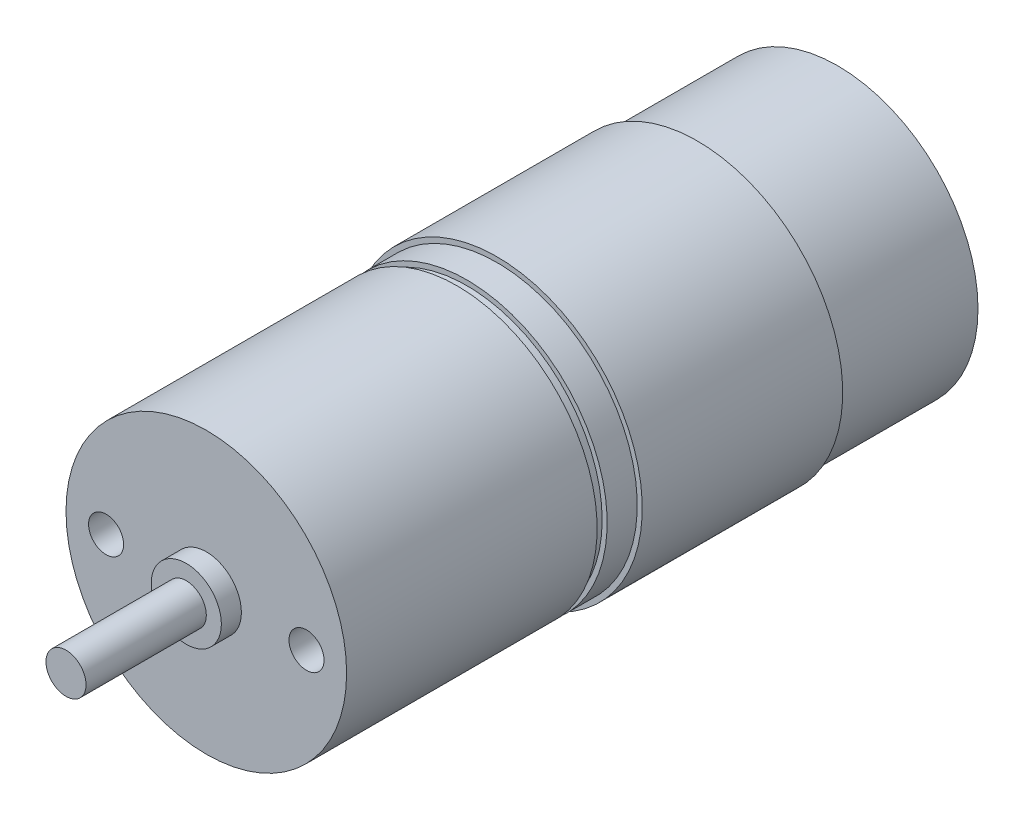
ISO-10303-21;
HEADER;
FILE_DESCRIPTION(('STEP AP214'),'2;1');
FILE_NAME('part.step','',(''),(''),'','','');
FILE_SCHEMA(('AUTOMOTIVE_DESIGN { 1 0 10303 214 1 1 1 1 }'));
ENDSEC;
DATA;
#1=APPLICATION_CONTEXT('core data for automotive mechanical design processes');
#2=APPLICATION_PROTOCOL_DEFINITION('international standard','automotive_design',2000,#1);
#3=PRODUCT_CONTEXT('',#1,'mechanical');
#4=PRODUCT('Part','Part','',(#3));
#5=PRODUCT_RELATED_PRODUCT_CATEGORY('part','',(#4));
#6=PRODUCT_DEFINITION_FORMATION('','',#4);
#7=PRODUCT_DEFINITION_CONTEXT('part definition',#1,'design');
#8=PRODUCT_DEFINITION('design','',#6,#7);
#9=PRODUCT_DEFINITION_SHAPE('','',#8);
#10=(LENGTH_UNIT() NAMED_UNIT(*) SI_UNIT(.MILLI.,.METRE.));
#11=(NAMED_UNIT(*) PLANE_ANGLE_UNIT() SI_UNIT($,.RADIAN.));
#12=(NAMED_UNIT(*) SI_UNIT($,.STERADIAN.) SOLID_ANGLE_UNIT());
#13=UNCERTAINTY_MEASURE_WITH_UNIT(LENGTH_MEASURE(1.E-05),#10,'distance_accuracy_value','');
#14=(GEOMETRIC_REPRESENTATION_CONTEXT(3) GLOBAL_UNCERTAINTY_ASSIGNED_CONTEXT((#13)) GLOBAL_UNIT_ASSIGNED_CONTEXT((#10,
#11,#12)) REPRESENTATION_CONTEXT('',''));
#15=CARTESIAN_POINT('',(0.,0.,0.));
#16=DIRECTION('',(0.,0.,1.));
#17=DIRECTION('',(1.,0.,0.));
#18=AXIS2_PLACEMENT_3D('',#15,#16,#17);
#19=CARTESIAN_POINT('',(0.,0.,63.));
#20=DIRECTION('',(0.,0.,-1.));
#21=DIRECTION('',(-1.,0.,0.));
#22=AXIS2_PLACEMENT_3D('',#19,#20,#21);
#23=CYLINDRICAL_SURFACE('',#22,14.);
#24=CARTESIAN_POINT('',(0.,0.,63.));
#25=DIRECTION('',(0.,0.,1.));
#26=DIRECTION('',(1.,0.,0.));
#27=AXIS2_PLACEMENT_3D('',#24,#25,#26);
#28=CIRCLE('',#27,14.);
#29=CARTESIAN_POINT('',(14.,0.,63.));
#30=VERTEX_POINT('',#29);
#31=EDGE_CURVE('E89',#30,#30,#28,.T.);
#32=ORIENTED_EDGE('',*,*,#31,.F.);
#33=EDGE_LOOP('',(#32));
#34=FACE_BOUND('',#33,.T.);
#35=CARTESIAN_POINT('',(0.,0.,38.));
#36=DIRECTION('',(0.,0.,-1.));
#37=DIRECTION('',(-1.,0.,0.));
#38=AXIS2_PLACEMENT_3D('',#35,#36,#37);
#39=CIRCLE('',#38,14.);
#40=CARTESIAN_POINT('',(-14.,0.,38.));
#41=VERTEX_POINT('',#40);
#42=EDGE_CURVE('E42',#41,#41,#39,.T.);
#43=ORIENTED_EDGE('',*,*,#42,.F.);
#44=EDGE_LOOP('',(#43));
#45=FACE_BOUND('',#44,.T.);
#46=ADVANCED_FACE('F38',(#34,#45),#23,.T.);
#47=CARTESIAN_POINT('',(0.,0.,63.));
#48=DIRECTION('',(0.,0.,1.));
#49=DIRECTION('',(1.,0.,0.));
#50=AXIS2_PLACEMENT_3D('',#47,#48,#49);
#51=PLANE('',#50);
#52=CARTESIAN_POINT('',(-10.,0.,63.));
#53=DIRECTION('',(0.,0.,1.));
#54=DIRECTION('',(1.,0.,0.));
#55=AXIS2_PLACEMENT_3D('',#52,#53,#54);
#56=CIRCLE('',#55,1.75);
#57=CARTESIAN_POINT('',(-8.25,0.,63.));
#58=VERTEX_POINT('',#57);
#59=EDGE_CURVE('E341',#58,#58,#56,.T.);
#60=ORIENTED_EDGE('',*,*,#59,.F.);
#61=EDGE_LOOP('',(#60));
#62=FACE_BOUND('',#61,.T.);
#63=CARTESIAN_POINT('',(10.,0.,63.));
#64=DIRECTION('',(0.,0.,1.));
#65=DIRECTION('',(1.,0.,0.));
#66=AXIS2_PLACEMENT_3D('',#63,#64,#65);
#67=CIRCLE('',#66,1.75);
#68=CARTESIAN_POINT('',(11.75,0.,63.));
#69=VERTEX_POINT('',#68);
#70=EDGE_CURVE('E344',#69,#69,#67,.T.);
#71=ORIENTED_EDGE('',*,*,#70,.F.);
#72=EDGE_LOOP('',(#71));
#73=FACE_BOUND('',#72,.T.);
#74=CARTESIAN_POINT('',(0.,0.,63.));
#75=DIRECTION('',(0.,0.,1.));
#76=DIRECTION('',(1.,0.,0.));
#77=AXIS2_PLACEMENT_3D('',#74,#75,#76);
#78=CIRCLE('',#77,3.5);
#79=CARTESIAN_POINT('',(3.5,0.,63.));
#80=VERTEX_POINT('',#79);
#81=EDGE_CURVE('E51',#80,#80,#78,.T.);
#82=ORIENTED_EDGE('',*,*,#81,.F.);
#83=EDGE_LOOP('',(#82));
#84=FACE_BOUND('',#83,.T.);
#85=ORIENTED_EDGE('',*,*,#31,.T.);
#86=EDGE_LOOP('',(#85));
#87=FACE_BOUND('',#86,.T.);
#88=ADVANCED_FACE('F109',(#62,#73,#84,#87),#51,.T.);
#89=CARTESIAN_POINT('',(0.,0.,65.));
#90=DIRECTION('',(0.,0.,-1.));
#91=DIRECTION('',(-1.,0.,0.));
#92=AXIS2_PLACEMENT_3D('',#89,#90,#91);
#93=CYLINDRICAL_SURFACE('',#92,3.5);
#94=CARTESIAN_POINT('',(0.,0.,65.));
#95=DIRECTION('',(0.,0.,1.));
#96=DIRECTION('',(1.,0.,0.));
#97=AXIS2_PLACEMENT_3D('',#94,#95,#96);
#98=CIRCLE('',#97,3.5);
#99=CARTESIAN_POINT('',(3.5,0.,65.));
#100=VERTEX_POINT('',#99);
#101=EDGE_CURVE('E82',#100,#100,#98,.T.);
#102=ORIENTED_EDGE('',*,*,#101,.F.);
#103=EDGE_LOOP('',(#102));
#104=FACE_BOUND('',#103,.T.);
#105=ORIENTED_EDGE('',*,*,#81,.T.);
#106=EDGE_LOOP('',(#105));
#107=FACE_BOUND('',#106,.T.);
#108=ADVANCED_FACE('F115',(#104,#107),#93,.T.);
#109=CARTESIAN_POINT('',(0.,0.,65.));
#110=DIRECTION('',(0.,0.,1.));
#111=DIRECTION('',(1.,0.,0.));
#112=AXIS2_PLACEMENT_3D('',#109,#110,#111);
#113=PLANE('',#112);
#114=CARTESIAN_POINT('',(0.,0.,65.));
#115=DIRECTION('',(0.,0.,1.));
#116=DIRECTION('',(1.,0.,0.));
#117=AXIS2_PLACEMENT_3D('',#114,#115,#116);
#118=CIRCLE('',#117,2.);
#119=CARTESIAN_POINT('',(2.,0.,65.));
#120=VERTEX_POINT('',#119);
#121=EDGE_CURVE('E46',#120,#120,#118,.T.);
#122=ORIENTED_EDGE('',*,*,#121,.F.);
#123=EDGE_LOOP('',(#122));
#124=FACE_BOUND('',#123,.T.);
#125=ORIENTED_EDGE('',*,*,#101,.T.);
#126=EDGE_LOOP('',(#125));
#127=FACE_BOUND('',#126,.T.);
#128=ADVANCED_FACE('F152',(#124,#127),#113,.T.);
#129=CARTESIAN_POINT('',(0.,0.,77.));
#130=DIRECTION('',(0.,0.,-1.));
#131=DIRECTION('',(-1.,0.,0.));
#132=AXIS2_PLACEMENT_3D('',#129,#130,#131);
#133=CYLINDRICAL_SURFACE('',#132,2.);
#134=CARTESIAN_POINT('',(0.,0.,77.));
#135=DIRECTION('',(0.,0.,1.));
#136=DIRECTION('',(1.,0.,0.));
#137=AXIS2_PLACEMENT_3D('',#134,#135,#136);
#138=CIRCLE('',#137,2.);
#139=CARTESIAN_POINT('',(2.,0.,77.));
#140=VERTEX_POINT('',#139);
#141=EDGE_CURVE('E80',#140,#140,#138,.T.);
#142=ORIENTED_EDGE('',*,*,#141,.F.);
#143=EDGE_LOOP('',(#142));
#144=FACE_BOUND('',#143,.T.);
#145=ORIENTED_EDGE('',*,*,#121,.T.);
#146=EDGE_LOOP('',(#145));
#147=FACE_BOUND('',#146,.T.);
#148=ADVANCED_FACE('F148',(#144,#147),#133,.T.);
#149=CARTESIAN_POINT('',(0.,0.,77.));
#150=DIRECTION('',(0.,0.,1.));
#151=DIRECTION('',(1.,0.,0.));
#152=AXIS2_PLACEMENT_3D('',#149,#150,#151);
#153=PLANE('',#152);
#154=ORIENTED_EDGE('',*,*,#141,.T.);
#155=EDGE_LOOP('',(#154));
#156=FACE_BOUND('',#155,.T.);
#157=ADVANCED_FACE('F144',(#156),#153,.T.);
#158=CARTESIAN_POINT('',(0.,0.,38.));
#159=DIRECTION('',(0.,0.,-1.));
#160=DIRECTION('',(-1.,0.,0.));
#161=AXIS2_PLACEMENT_3D('',#158,#159,#160);
#162=PLANE('',#161);
#163=CARTESIAN_POINT('',(0.,0.,38.));
#164=DIRECTION('',(0.,0.,-1.));
#165=DIRECTION('',(-1.,0.,0.));
#166=AXIS2_PLACEMENT_3D('',#163,#164,#165);
#167=CIRCLE('',#166,13.5);
#168=CARTESIAN_POINT('',(-13.5,0.,38.));
#169=VERTEX_POINT('',#168);
#170=EDGE_CURVE('E58',#169,#169,#167,.T.);
#171=ORIENTED_EDGE('',*,*,#170,.F.);
#172=EDGE_LOOP('',(#171));
#173=FACE_BOUND('',#172,.T.);
#174=ORIENTED_EDGE('',*,*,#42,.T.);
#175=EDGE_LOOP('',(#174));
#176=FACE_BOUND('',#175,.T.);
#177=ADVANCED_FACE('F147',(#173,#176),#162,.T.);
#178=CARTESIAN_POINT('',(0.,0.,37.));
#179=DIRECTION('',(0.,0.,-1.));
#180=DIRECTION('',(-1.,0.,0.));
#181=AXIS2_PLACEMENT_3D('',#178,#179,#180);
#182=PLANE('',#181);
#183=CARTESIAN_POINT('',(0.,0.,37.));
#184=DIRECTION('',(0.,0.,-1.));
#185=DIRECTION('',(-1.,0.,0.));
#186=AXIS2_PLACEMENT_3D('',#183,#184,#185);
#187=CIRCLE('',#186,13.5);
#188=CARTESIAN_POINT('',(-13.5,0.,37.));
#189=VERTEX_POINT('',#188);
#190=EDGE_CURVE('E64',#189,#189,#187,.T.);
#191=ORIENTED_EDGE('',*,*,#190,.T.);
#192=EDGE_LOOP('',(#191));
#193=FACE_BOUND('',#192,.T.);
#194=CARTESIAN_POINT('',(0.,0.,37.));
#195=DIRECTION('',(0.,0.,-1.));
#196=DIRECTION('',(-1.,0.,0.));
#197=AXIS2_PLACEMENT_3D('',#194,#195,#196);
#198=CIRCLE('',#197,14.);
#199=CARTESIAN_POINT('',(-14.,0.,37.));
#200=VERTEX_POINT('',#199);
#201=EDGE_CURVE('E56',#200,#200,#198,.T.);
#202=ORIENTED_EDGE('',*,*,#201,.F.);
#203=EDGE_LOOP('',(#202));
#204=FACE_BOUND('',#203,.T.);
#205=ADVANCED_FACE('F105',(#193,#204),#182,.F.);
#206=CARTESIAN_POINT('',(0.,0.,38.));
#207=DIRECTION('',(0.,0.,-1.));
#208=DIRECTION('',(-1.,0.,0.));
#209=AXIS2_PLACEMENT_3D('',#206,#207,#208);
#210=CYLINDRICAL_SURFACE('',#209,13.5);
#211=ORIENTED_EDGE('',*,*,#170,.T.);
#212=EDGE_LOOP('',(#211));
#213=FACE_BOUND('',#212,.T.);
#214=ORIENTED_EDGE('',*,*,#190,.F.);
#215=EDGE_LOOP('',(#214));
#216=FACE_BOUND('',#215,.T.);
#217=ADVANCED_FACE('F97',(#213,#216),#210,.T.);
#218=CARTESIAN_POINT('',(0.,0.,0.));
#219=DIRECTION('',(0.,0.,1.));
#220=DIRECTION('',(1.,0.,0.));
#221=AXIS2_PLACEMENT_3D('',#218,#219,#220);
#222=PLANE('',#221);
#223=CARTESIAN_POINT('',(0.,0.,0.));
#224=DIRECTION('',(0.,0.,1.));
#225=DIRECTION('',(1.,0.,0.));
#226=AXIS2_PLACEMENT_3D('',#223,#224,#225);
#227=CIRCLE('',#226,14.);
#228=CARTESIAN_POINT('',(14.,0.,0.));
#229=VERTEX_POINT('',#228);
#230=EDGE_CURVE('E86',#229,#229,#227,.T.);
#231=ORIENTED_EDGE('',*,*,#230,.F.);
#232=EDGE_LOOP('',(#231));
#233=FACE_BOUND('',#232,.T.);
#234=ADVANCED_FACE('F95',(#233),#222,.F.);
#235=CARTESIAN_POINT('',(0.,0.,14.));
#236=DIRECTION('',(0.,0.,-1.));
#237=DIRECTION('',(-1.,0.,0.));
#238=AXIS2_PLACEMENT_3D('',#235,#236,#237);
#239=CIRCLE('',#238,14.);
#240=CARTESIAN_POINT('',(-14.,0.,14.));
#241=VERTEX_POINT('',#240);
#242=EDGE_CURVE('E54',#241,#241,#239,.T.);
#243=ORIENTED_EDGE('',*,*,#242,.T.);
#244=EDGE_LOOP('',(#243));
#245=FACE_BOUND('',#244,.T.);
#246=ORIENTED_EDGE('',*,*,#230,.T.);
#247=EDGE_LOOP('',(#246));
#248=FACE_BOUND('',#247,.T.);
#249=ADVANCED_FACE('F40',(#245,#248),#23,.T.);
#250=CARTESIAN_POINT('',(0.,0.,14.));
#251=DIRECTION('',(0.,0.,-1.));
#252=DIRECTION('',(-1.,0.,0.));
#253=AXIS2_PLACEMENT_3D('',#250,#251,#252);
#254=PLANE('',#253);
#255=ORIENTED_EDGE('',*,*,#242,.F.);
#256=EDGE_LOOP('',(#255));
#257=FACE_BOUND('',#256,.T.);
#258=CARTESIAN_POINT('',(0.,0.,14.));
#259=DIRECTION('',(0.,0.,-1.));
#260=DIRECTION('',(-1.,0.,0.));
#261=AXIS2_PLACEMENT_3D('',#258,#259,#260);
#262=CIRCLE('',#261,14.5);
#263=CARTESIAN_POINT('',(-14.5,0.,14.));
#264=VERTEX_POINT('',#263);
#265=EDGE_CURVE('E62',#264,#264,#262,.T.);
#266=ORIENTED_EDGE('',*,*,#265,.T.);
#267=EDGE_LOOP('',(#266));
#268=FACE_BOUND('',#267,.T.);
#269=ADVANCED_FACE('F102',(#257,#268),#254,.T.);
#270=CARTESIAN_POINT('',(0.,0.,34.));
#271=DIRECTION('',(0.,0.,-1.));
#272=DIRECTION('',(-1.,0.,0.));
#273=AXIS2_PLACEMENT_3D('',#270,#271,#272);
#274=CYLINDRICAL_SURFACE('',#273,14.5);
#275=CARTESIAN_POINT('',(0.,0.,34.));
#276=DIRECTION('',(0.,0.,-1.));
#277=DIRECTION('',(-1.,0.,0.));
#278=AXIS2_PLACEMENT_3D('',#275,#276,#277);
#279=CIRCLE('',#278,14.5);
#280=CARTESIAN_POINT('',(-14.5,0.,34.));
#281=VERTEX_POINT('',#280);
#282=EDGE_CURVE('E75',#281,#281,#279,.T.);
#283=ORIENTED_EDGE('',*,*,#282,.T.);
#284=EDGE_LOOP('',(#283));
#285=FACE_BOUND('',#284,.T.);
#286=ORIENTED_EDGE('',*,*,#265,.F.);
#287=EDGE_LOOP('',(#286));
#288=FACE_BOUND('',#287,.T.);
#289=ADVANCED_FACE('F129',(#285,#288),#274,.T.);
#290=CARTESIAN_POINT('',(0.,0.,34.));
#291=DIRECTION('',(0.,0.,-1.));
#292=DIRECTION('',(-1.,0.,0.));
#293=AXIS2_PLACEMENT_3D('',#290,#291,#292);
#294=PLANE('',#293);
#295=CARTESIAN_POINT('',(0.,0.,34.));
#296=DIRECTION('',(0.,0.,-1.));
#297=DIRECTION('',(-1.,0.,0.));
#298=AXIS2_PLACEMENT_3D('',#295,#296,#297);
#299=CIRCLE('',#298,14.);
#300=CARTESIAN_POINT('',(-14.,0.,34.));
#301=VERTEX_POINT('',#300);
#302=EDGE_CURVE('E11',#301,#301,#299,.T.);
#303=ORIENTED_EDGE('',*,*,#302,.T.);
#304=EDGE_LOOP('',(#303));
#305=FACE_BOUND('',#304,.T.);
#306=ORIENTED_EDGE('',*,*,#282,.F.);
#307=EDGE_LOOP('',(#306));
#308=FACE_BOUND('',#307,.T.);
#309=ADVANCED_FACE('F121',(#305,#308),#294,.F.);
#310=ORIENTED_EDGE('',*,*,#201,.T.);
#311=EDGE_LOOP('',(#310));
#312=FACE_BOUND('',#311,.T.);
#313=ORIENTED_EDGE('',*,*,#302,.F.);
#314=EDGE_LOOP('',(#313));
#315=FACE_BOUND('',#314,.T.);
#316=ADVANCED_FACE('F104',(#312,#315),#23,.T.);
#317=CARTESIAN_POINT('',(10.,0.,53.));
#318=DIRECTION('',(0.,0.,1.));
#319=DIRECTION('',(1.,0.,0.));
#320=AXIS2_PLACEMENT_3D('',#317,#318,#319);
#321=CYLINDRICAL_SURFACE('',#320,1.75);
#322=CARTESIAN_POINT('',(10.,0.,53.));
#323=DIRECTION('',(0.,0.,1.));
#324=DIRECTION('',(1.,0.,0.));
#325=AXIS2_PLACEMENT_3D('',#322,#323,#324);
#326=CIRCLE('',#325,1.75);
#327=CARTESIAN_POINT('',(11.75,0.,53.));
#328=VERTEX_POINT('',#327);
#329=EDGE_CURVE('E72',#328,#328,#326,.T.);
#330=ORIENTED_EDGE('',*,*,#329,.F.);
#331=EDGE_LOOP('',(#330));
#332=FACE_BOUND('',#331,.T.);
#333=ORIENTED_EDGE('',*,*,#70,.T.);
#334=EDGE_LOOP('',(#333));
#335=FACE_BOUND('',#334,.T.);
#336=ADVANCED_FACE('F120',(#332,#335),#321,.F.);
#337=CARTESIAN_POINT('',(10.,0.,53.));
#338=DIRECTION('',(0.,0.,1.));
#339=DIRECTION('',(1.,0.,0.));
#340=AXIS2_PLACEMENT_3D('',#337,#338,#339);
#341=PLANE('',#340);
#342=ORIENTED_EDGE('',*,*,#329,.T.);
#343=EDGE_LOOP('',(#342));
#344=FACE_BOUND('',#343,.T.);
#345=ADVANCED_FACE('F126',(#344),#341,.T.);
#346=CARTESIAN_POINT('',(-10.,0.,53.));
#347=DIRECTION('',(0.,0.,1.));
#348=DIRECTION('',(1.,0.,0.));
#349=AXIS2_PLACEMENT_3D('',#346,#347,#348);
#350=CYLINDRICAL_SURFACE('',#349,1.75);
#351=CARTESIAN_POINT('',(-10.,0.,53.));
#352=DIRECTION('',(0.,0.,1.));
#353=DIRECTION('',(1.,0.,0.));
#354=AXIS2_PLACEMENT_3D('',#351,#352,#353);
#355=CIRCLE('',#354,1.75);
#356=CARTESIAN_POINT('',(-8.25,0.,53.));
#357=VERTEX_POINT('',#356);
#358=EDGE_CURVE('E69',#357,#357,#355,.T.);
#359=ORIENTED_EDGE('',*,*,#358,.F.);
#360=EDGE_LOOP('',(#359));
#361=FACE_BOUND('',#360,.T.);
#362=ORIENTED_EDGE('',*,*,#59,.T.);
#363=EDGE_LOOP('',(#362));
#364=FACE_BOUND('',#363,.T.);
#365=ADVANCED_FACE('F230',(#361,#364),#350,.F.);
#366=CARTESIAN_POINT('',(-10.,0.,53.));
#367=DIRECTION('',(0.,0.,1.));
#368=DIRECTION('',(1.,0.,0.));
#369=AXIS2_PLACEMENT_3D('',#366,#367,#368);
#370=PLANE('',#369);
#371=ORIENTED_EDGE('',*,*,#358,.T.);
#372=EDGE_LOOP('',(#371));
#373=FACE_BOUND('',#372,.T.);
#374=ADVANCED_FACE('F241',(#373),#370,.T.);
#375=CLOSED_SHELL('',(#46,#88,#108,#128,#148,#157,#177,#205,#217,#234,#249,#269,#289,#309,#316,
#336,#345,#365,#374));
#376=MANIFOLD_SOLID_BREP('B2',#375);
#377=ADVANCED_BREP_SHAPE_REPRESENTATION('',(#18,#376),#14);
#378=SHAPE_DEFINITION_REPRESENTATION(#9,#377);
ENDSEC;
END-ISO-10303-21;
